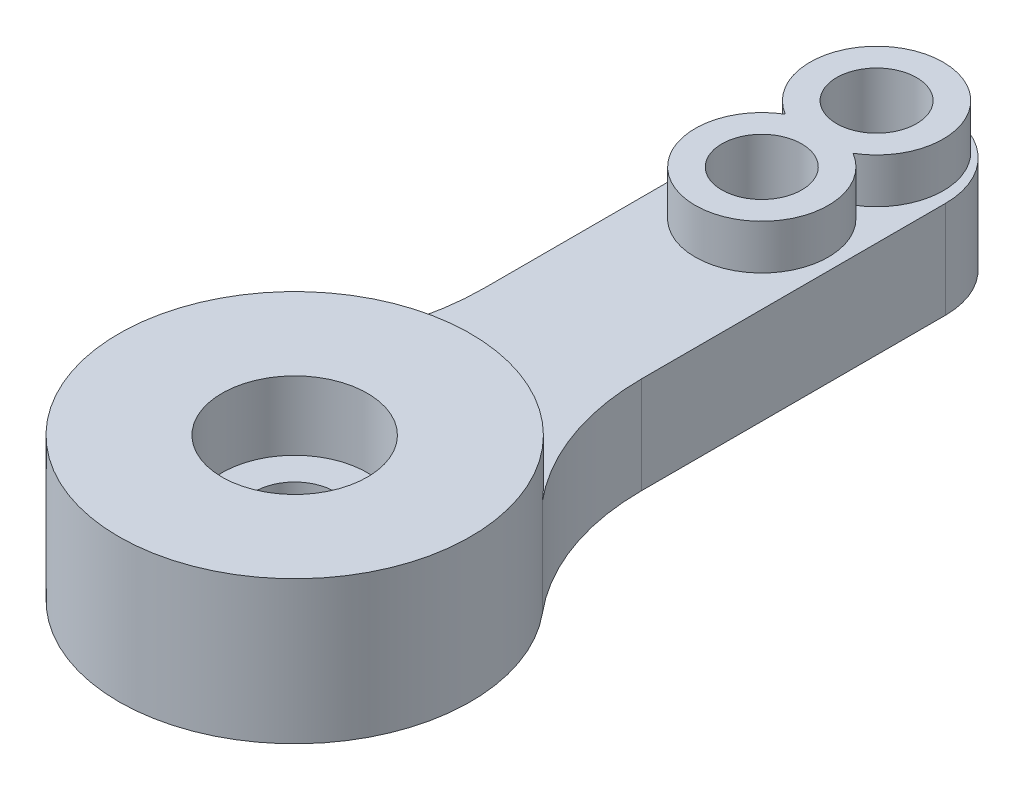
ISO-10303-21;
HEADER;
FILE_DESCRIPTION(('STEP AP214'),'2;1');
FILE_NAME('part.step','',(''),(''),'','','');
FILE_SCHEMA(('AUTOMOTIVE_DESIGN { 1 0 10303 214 1 1 1 1 }'));
ENDSEC;
DATA;
#1=APPLICATION_CONTEXT('core data for automotive mechanical design processes');
#2=APPLICATION_PROTOCOL_DEFINITION('international standard','automotive_design',2000,#1);
#3=PRODUCT_CONTEXT('',#1,'mechanical');
#4=PRODUCT('Part','Part','',(#3));
#5=PRODUCT_RELATED_PRODUCT_CATEGORY('part','',(#4));
#6=PRODUCT_DEFINITION_FORMATION('','',#4);
#7=PRODUCT_DEFINITION_CONTEXT('part definition',#1,'design');
#8=PRODUCT_DEFINITION('design','',#6,#7);
#9=PRODUCT_DEFINITION_SHAPE('','',#8);
#10=(LENGTH_UNIT() NAMED_UNIT(*) SI_UNIT(.MILLI.,.METRE.));
#11=(NAMED_UNIT(*) PLANE_ANGLE_UNIT() SI_UNIT($,.RADIAN.));
#12=(NAMED_UNIT(*) SI_UNIT($,.STERADIAN.) SOLID_ANGLE_UNIT());
#13=UNCERTAINTY_MEASURE_WITH_UNIT(LENGTH_MEASURE(1.E-05),#10,'distance_accuracy_value','');
#14=(GEOMETRIC_REPRESENTATION_CONTEXT(3) GLOBAL_UNCERTAINTY_ASSIGNED_CONTEXT((#13)) GLOBAL_UNIT_ASSIGNED_CONTEXT((#10,
#11,#12)) REPRESENTATION_CONTEXT('',''));
#15=CARTESIAN_POINT('',(0.,0.,0.));
#16=DIRECTION('',(0.,0.,1.));
#17=DIRECTION('',(1.,0.,0.));
#18=AXIS2_PLACEMENT_3D('',#15,#16,#17);
#19=CARTESIAN_POINT('',(0.,0.,0.));
#20=DIRECTION('',(0.,1.,0.));
#21=DIRECTION('',(0.,0.,1.));
#22=AXIS2_PLACEMENT_3D('',#19,#20,#21);
#23=CYLINDRICAL_SURFACE('',#22,1.65);
#24=CARTESIAN_POINT('',(0.,0.,0.));
#25=DIRECTION('',(0.,1.,0.));
#26=DIRECTION('',(0.,0.,1.));
#27=AXIS2_PLACEMENT_3D('',#24,#25,#26);
#28=CIRCLE('',#27,1.65);
#29=CARTESIAN_POINT('',(0.,0.,1.65));
#30=VERTEX_POINT('',#29);
#31=EDGE_CURVE('E125',#30,#30,#28,.T.);
#32=ORIENTED_EDGE('',*,*,#31,.F.);
#33=EDGE_LOOP('',(#32));
#34=FACE_BOUND('',#33,.T.);
#35=CARTESIAN_POINT('',(0.,3.06,0.));
#36=DIRECTION('',(0.,1.,0.));
#37=DIRECTION('',(0.,0.,1.));
#38=AXIS2_PLACEMENT_3D('',#35,#36,#37);
#39=CIRCLE('',#38,1.65);
#40=CARTESIAN_POINT('',(0.,3.06,1.65));
#41=VERTEX_POINT('',#40);
#42=EDGE_CURVE('E36',#41,#41,#39,.F.);
#43=ORIENTED_EDGE('',*,*,#42,.F.);
#44=EDGE_LOOP('',(#43));
#45=FACE_BOUND('',#44,.T.);
#46=ADVANCED_FACE('F32',(#34,#45),#23,.F.);
#47=CARTESIAN_POINT('',(0.,4.,-23.625));
#48=DIRECTION('',(0.,1.,0.));
#49=DIRECTION('',(0.,0.,1.));
#50=AXIS2_PLACEMENT_3D('',#47,#48,#49);
#51=PLANE('',#50);
#52=CARTESIAN_POINT('',(0.,4.,0.));
#53=DIRECTION('',(0.,1.,0.));
#54=DIRECTION('',(0.,0.,1.));
#55=AXIS2_PLACEMENT_3D('',#52,#53,#54);
#56=CIRCLE('',#55,7.26);
#57=CARTESIAN_POINT('',(5.57118771726538,4.,-4.65504752059433));
#58=VERTEX_POINT('',#57);
#59=CARTESIAN_POINT('',(-5.57118771726542,4.,-4.65504752059427));
#60=VERTEX_POINT('',#59);
#61=EDGE_CURVE('E128',#58,#60,#56,.T.);
#62=ORIENTED_EDGE('',*,*,#61,.F.);
#63=CARTESIAN_POINT('',(13.2450000000001,4.,-11.066958705986));
#64=DIRECTION('',(0.,1.,0.));
#65=DIRECTION('',(0.,0.,1.));
#66=AXIS2_PLACEMENT_3D('',#63,#64,#65);
#67=CIRCLE('',#66,10.);
#68=CARTESIAN_POINT('',(3.24500000000006,4.,-11.0669587059861));
#69=VERTEX_POINT('',#68);
#70=EDGE_CURVE('E170',#58,#69,#67,.F.);
#71=ORIENTED_EDGE('',*,*,#70,.T.);
#72=DIRECTION('',(0.,0.,-1.));
#73=VECTOR('',#72,1.);
#74=CARTESIAN_POINT('',(3.24500000000023,4.,-23.625));
#75=LINE('',#74,#73);
#76=CARTESIAN_POINT('',(3.24500000000023,4.,-23.625));
#77=VERTEX_POINT('',#76);
#78=EDGE_CURVE('E142',#69,#77,#75,.T.);
#79=ORIENTED_EDGE('',*,*,#78,.T.);
#80=CARTESIAN_POINT('',(0.,4.,-23.625));
#81=DIRECTION('',(0.,1.,0.));
#82=DIRECTION('',(0.,0.,1.));
#83=AXIS2_PLACEMENT_3D('',#80,#81,#82);
#84=CIRCLE('',#83,3.24500000000011);
#85=CARTESIAN_POINT('',(-3.245,4.,-23.625));
#86=VERTEX_POINT('',#85);
#87=EDGE_CURVE('E136',#77,#86,#84,.T.);
#88=ORIENTED_EDGE('',*,*,#87,.T.);
#89=DIRECTION('',(0.,0.,1.));
#90=VECTOR('',#89,1.);
#91=CARTESIAN_POINT('',(-3.24500000000022,4.,-6.49442645658557));
#92=LINE('',#91,#90);
#93=CARTESIAN_POINT('',(-3.24500000000016,4.,-11.0669587059857));
#94=VERTEX_POINT('',#93);
#95=EDGE_CURVE('E139',#86,#94,#92,.T.);
#96=ORIENTED_EDGE('',*,*,#95,.T.);
#97=CARTESIAN_POINT('',(-13.2450000000002,4.,-11.0669587059858));
#98=DIRECTION('',(0.,1.,0.));
#99=DIRECTION('',(0.,0.,1.));
#100=AXIS2_PLACEMENT_3D('',#97,#98,#99);
#101=CIRCLE('',#100,10.);
#102=EDGE_CURVE('E11',#94,#60,#101,.F.);
#103=ORIENTED_EDGE('',*,*,#102,.T.);
#104=EDGE_LOOP('',(#62,#71,#79,#88,#96,#103));
#105=FACE_BOUND('',#104,.T.);
#106=CARTESIAN_POINT('',(0.,4.,-24.02));
#107=DIRECTION('',(0.,1.,0.));
#108=DIRECTION('',(0.,0.,1.));
#109=AXIS2_PLACEMENT_3D('',#106,#107,#108);
#110=CIRCLE('',#109,2.75);
#111=CARTESIAN_POINT('',(1.39484766193302,4.,-21.65));
#112=VERTEX_POINT('',#111);
#113=CARTESIAN_POINT('',(-1.39484766193302,4.,-21.65));
#114=VERTEX_POINT('',#113);
#115=EDGE_CURVE('E112',#112,#114,#110,.T.);
#116=ORIENTED_EDGE('',*,*,#115,.F.);
#117=CARTESIAN_POINT('',(0.,4.,-19.28));
#118=DIRECTION('',(0.,1.,0.));
#119=DIRECTION('',(0.,0.,1.));
#120=AXIS2_PLACEMENT_3D('',#117,#118,#119);
#121=CIRCLE('',#120,2.75);
#122=EDGE_CURVE('E116',#114,#112,#121,.T.);
#123=ORIENTED_EDGE('',*,*,#122,.F.);
#124=EDGE_LOOP('',(#116,#123));
#125=FACE_BOUND('',#124,.T.);
#126=ADVANCED_FACE('F175',(#105,#125),#51,.T.);
#127=CARTESIAN_POINT('',(0.,4.,-23.625));
#128=DIRECTION('',(0.,-1.,0.));
#129=DIRECTION('',(0.,0.,-1.));
#130=AXIS2_PLACEMENT_3D('',#127,#128,#129);
#131=CYLINDRICAL_SURFACE('',#130,3.24500000000011);
#132=CARTESIAN_POINT('',(0.,0.,-23.625));
#133=DIRECTION('',(0.,1.,0.));
#134=DIRECTION('',(0.,0.,1.));
#135=AXIS2_PLACEMENT_3D('',#132,#133,#134);
#136=CIRCLE('',#135,3.24500000000011);
#137=CARTESIAN_POINT('',(3.24500000000023,0.,-23.625));
#138=VERTEX_POINT('',#137);
#139=CARTESIAN_POINT('',(-3.245,0.,-23.625));
#140=VERTEX_POINT('',#139);
#141=EDGE_CURVE('E134',#138,#140,#136,.T.);
#142=ORIENTED_EDGE('',*,*,#141,.T.);
#143=DIRECTION('',(0.,-1.,0.));
#144=VECTOR('',#143,1.);
#145=CARTESIAN_POINT('',(-3.245,4.,-23.625));
#146=LINE('',#145,#144);
#147=EDGE_CURVE('E155',#86,#140,#146,.T.);
#148=ORIENTED_EDGE('',*,*,#147,.F.);
#149=ORIENTED_EDGE('',*,*,#87,.F.);
#150=DIRECTION('',(0.,-1.,0.));
#151=VECTOR('',#150,1.);
#152=CARTESIAN_POINT('',(3.24500000000023,4.,-23.625));
#153=LINE('',#152,#151);
#154=EDGE_CURVE('E144',#77,#138,#153,.T.);
#155=ORIENTED_EDGE('',*,*,#154,.T.);
#156=EDGE_LOOP('',(#142,#148,#149,#155));
#157=FACE_BOUND('',#156,.T.);
#158=ADVANCED_FACE('F197',(#157),#131,.T.);
#159=CARTESIAN_POINT('',(-3.24500000000022,4.,-6.49442645658557));
#160=DIRECTION('',(1.,0.,0.));
#161=DIRECTION('',(0.,0.,-1.));
#162=AXIS2_PLACEMENT_3D('',#159,#160,#161);
#163=PLANE('',#162);
#164=DIRECTION('',(0.,0.,1.));
#165=VECTOR('',#164,1.);
#166=CARTESIAN_POINT('',(-3.24500000000022,0.,-6.49442645658557));
#167=LINE('',#166,#165);
#168=CARTESIAN_POINT('',(-3.24500000000016,0.,-11.0669587059857));
#169=VERTEX_POINT('',#168);
#170=EDGE_CURVE('E147',#140,#169,#167,.T.);
#171=ORIENTED_EDGE('',*,*,#170,.T.);
#172=DIRECTION('',(0.,1.,0.));
#173=VECTOR('',#172,1.);
#174=CARTESIAN_POINT('',(-3.24500000000016,4.,-11.0669587059857));
#175=LINE('',#174,#173);
#176=EDGE_CURVE('E48',#169,#94,#175,.T.);
#177=ORIENTED_EDGE('',*,*,#176,.T.);
#178=ORIENTED_EDGE('',*,*,#95,.F.);
#179=ORIENTED_EDGE('',*,*,#147,.T.);
#180=EDGE_LOOP('',(#171,#177,#178,#179));
#181=FACE_BOUND('',#180,.T.);
#182=ADVANCED_FACE('F195',(#181),#163,.F.);
#183=CARTESIAN_POINT('',(0.,4.,0.));
#184=DIRECTION('',(0.,-1.,0.));
#185=DIRECTION('',(0.,0.,-1.));
#186=AXIS2_PLACEMENT_3D('',#183,#184,#185);
#187=CYLINDRICAL_SURFACE('',#186,7.26);
#188=CARTESIAN_POINT('',(0.,0.,0.));
#189=DIRECTION('',(0.,1.,0.));
#190=DIRECTION('',(0.,0.,1.));
#191=AXIS2_PLACEMENT_3D('',#188,#189,#190);
#192=CIRCLE('',#191,7.26);
#193=CARTESIAN_POINT('',(-5.57118771726542,0.,-4.65504752059427));
#194=VERTEX_POINT('',#193);
#195=CARTESIAN_POINT('',(5.57118771726538,0.,-4.65504752059433));
#196=VERTEX_POINT('',#195);
#197=EDGE_CURVE('E149',#194,#196,#192,.T.);
#198=ORIENTED_EDGE('',*,*,#197,.T.);
#199=DIRECTION('',(0.,-1.,0.));
#200=VECTOR('',#199,1.);
#201=CARTESIAN_POINT('',(5.57118771726538,4.,-4.65504752059433));
#202=LINE('',#201,#200);
#203=EDGE_CURVE('E164',#196,#58,#202,.F.);
#204=ORIENTED_EDGE('',*,*,#203,.T.);
#205=ORIENTED_EDGE('',*,*,#61,.T.);
#206=DIRECTION('',(0.,-1.,0.));
#207=VECTOR('',#206,1.);
#208=CARTESIAN_POINT('',(-5.57118771726542,4.,-4.65504752059427));
#209=LINE('',#208,#207);
#210=EDGE_CURVE('E161',#60,#194,#209,.T.);
#211=ORIENTED_EDGE('',*,*,#210,.T.);
#212=EDGE_LOOP('',(#198,#204,#205,#211));
#213=FACE_BOUND('',#212,.T.);
#214=CARTESIAN_POINT('',(0.,5.9,0.));
#215=DIRECTION('',(0.,1.,0.));
#216=DIRECTION('',(0.,0.,1.));
#217=AXIS2_PLACEMENT_3D('',#214,#215,#216);
#218=CIRCLE('',#217,7.26);
#219=CARTESIAN_POINT('',(0.,5.9,7.26));
#220=VERTEX_POINT('',#219);
#221=EDGE_CURVE('E131',#220,#220,#218,.T.);
#222=ORIENTED_EDGE('',*,*,#221,.F.);
#223=EDGE_LOOP('',(#222));
#224=FACE_BOUND('',#223,.T.);
#225=ADVANCED_FACE('F189',(#213,#224),#187,.T.);
#226=CARTESIAN_POINT('',(3.24500000000023,4.,-23.625));
#227=DIRECTION('',(-1.,0.,0.));
#228=DIRECTION('',(0.,0.,1.));
#229=AXIS2_PLACEMENT_3D('',#226,#227,#228);
#230=PLANE('',#229);
#231=ORIENTED_EDGE('',*,*,#78,.F.);
#232=DIRECTION('',(0.,1.,0.));
#233=VECTOR('',#232,1.);
#234=CARTESIAN_POINT('',(3.24500000000006,0.,-11.0669587059861));
#235=LINE('',#234,#233);
#236=CARTESIAN_POINT('',(3.24500000000006,0.,-11.0669587059861));
#237=VERTEX_POINT('',#236);
#238=EDGE_CURVE('E158',#69,#237,#235,.F.);
#239=ORIENTED_EDGE('',*,*,#238,.T.);
#240=DIRECTION('',(0.,0.,-1.));
#241=VECTOR('',#240,1.);
#242=CARTESIAN_POINT('',(3.24500000000023,0.,-23.625));
#243=LINE('',#242,#241);
#244=EDGE_CURVE('E140',#237,#138,#243,.T.);
#245=ORIENTED_EDGE('',*,*,#244,.T.);
#246=ORIENTED_EDGE('',*,*,#154,.F.);
#247=EDGE_LOOP('',(#231,#239,#245,#246));
#248=FACE_BOUND('',#247,.T.);
#249=ADVANCED_FACE('F182',(#248),#230,.F.);
#250=CARTESIAN_POINT('',(0.,0.,-23.625));
#251=DIRECTION('',(0.,1.,0.));
#252=DIRECTION('',(0.,0.,1.));
#253=AXIS2_PLACEMENT_3D('',#250,#251,#252);
#254=PLANE('',#253);
#255=ORIENTED_EDGE('',*,*,#31,.T.);
#256=EDGE_LOOP('',(#255));
#257=FACE_BOUND('',#256,.T.);
#258=CARTESIAN_POINT('',(0.,0.,-19.28));
#259=DIRECTION('',(0.,1.,0.));
#260=DIRECTION('',(0.,0.,1.));
#261=AXIS2_PLACEMENT_3D('',#258,#259,#260);
#262=CIRCLE('',#261,1.65);
#263=CARTESIAN_POINT('',(0.,0.,-17.63));
#264=VERTEX_POINT('',#263);
#265=EDGE_CURVE('E120',#264,#264,#262,.T.);
#266=ORIENTED_EDGE('',*,*,#265,.T.);
#267=EDGE_LOOP('',(#266));
#268=FACE_BOUND('',#267,.T.);
#269=CARTESIAN_POINT('',(0.,0.,-24.02));
#270=DIRECTION('',(0.,1.,0.));
#271=DIRECTION('',(0.,0.,1.));
#272=AXIS2_PLACEMENT_3D('',#269,#270,#271);
#273=CIRCLE('',#272,1.65);
#274=CARTESIAN_POINT('',(0.,0.,-22.37));
#275=VERTEX_POINT('',#274);
#276=EDGE_CURVE('E117',#275,#275,#273,.T.);
#277=ORIENTED_EDGE('',*,*,#276,.T.);
#278=EDGE_LOOP('',(#277));
#279=FACE_BOUND('',#278,.T.);
#280=ORIENTED_EDGE('',*,*,#141,.F.);
#281=ORIENTED_EDGE('',*,*,#244,.F.);
#282=CARTESIAN_POINT('',(13.2450000000001,0.,-11.066958705986));
#283=DIRECTION('',(0.,1.,0.));
#284=DIRECTION('',(0.,0.,1.));
#285=AXIS2_PLACEMENT_3D('',#282,#283,#284);
#286=CIRCLE('',#285,10.);
#287=EDGE_CURVE('E168',#237,#196,#286,.T.);
#288=ORIENTED_EDGE('',*,*,#287,.T.);
#289=ORIENTED_EDGE('',*,*,#197,.F.);
#290=CARTESIAN_POINT('',(-13.2450000000002,0.,-11.0669587059858));
#291=DIRECTION('',(0.,1.,0.));
#292=DIRECTION('',(0.,0.,1.));
#293=AXIS2_PLACEMENT_3D('',#290,#291,#292);
#294=CIRCLE('',#293,10.);
#295=EDGE_CURVE('E41',#194,#169,#294,.T.);
#296=ORIENTED_EDGE('',*,*,#295,.T.);
#297=ORIENTED_EDGE('',*,*,#170,.F.);
#298=EDGE_LOOP('',(#280,#281,#288,#289,#296,#297));
#299=FACE_BOUND('',#298,.T.);
#300=ADVANCED_FACE('F187',(#257,#268,#279,#299),#254,.F.);
#301=CARTESIAN_POINT('',(0.,5.9,0.));
#302=DIRECTION('',(0.,1.,0.));
#303=DIRECTION('',(0.,0.,1.));
#304=AXIS2_PLACEMENT_3D('',#301,#302,#303);
#305=PLANE('',#304);
#306=CARTESIAN_POINT('',(0.,5.9,0.));
#307=DIRECTION('',(0.,1.,0.));
#308=DIRECTION('',(0.,0.,1.));
#309=AXIS2_PLACEMENT_3D('',#306,#307,#308);
#310=CIRCLE('',#309,3.);
#311=CARTESIAN_POINT('',(0.,5.9,3.));
#312=VERTEX_POINT('',#311);
#313=EDGE_CURVE('E362',#312,#312,#310,.T.);
#314=ORIENTED_EDGE('',*,*,#313,.F.);
#315=EDGE_LOOP('',(#314));
#316=FACE_BOUND('',#315,.T.);
#317=ORIENTED_EDGE('',*,*,#221,.T.);
#318=EDGE_LOOP('',(#317));
#319=FACE_BOUND('',#318,.T.);
#320=ADVANCED_FACE('F223',(#316,#319),#305,.T.);
#321=CARTESIAN_POINT('',(0.,0.,-24.02));
#322=DIRECTION('',(0.,1.,0.));
#323=DIRECTION('',(0.,0.,1.));
#324=AXIS2_PLACEMENT_3D('',#321,#322,#323);
#325=CYLINDRICAL_SURFACE('',#324,1.65);
#326=ORIENTED_EDGE('',*,*,#276,.F.);
#327=EDGE_LOOP('',(#326));
#328=FACE_BOUND('',#327,.T.);
#329=CARTESIAN_POINT('',(0.,5.85,-24.02));
#330=DIRECTION('',(0.,1.,0.));
#331=DIRECTION('',(0.,0.,1.));
#332=AXIS2_PLACEMENT_3D('',#329,#330,#331);
#333=CIRCLE('',#332,1.65);
#334=CARTESIAN_POINT('',(0.,5.85,-22.37));
#335=VERTEX_POINT('',#334);
#336=EDGE_CURVE('E369',#335,#335,#333,.T.);
#337=ORIENTED_EDGE('',*,*,#336,.T.);
#338=EDGE_LOOP('',(#337));
#339=FACE_BOUND('',#338,.T.);
#340=ADVANCED_FACE('F219',(#328,#339),#325,.F.);
#341=CARTESIAN_POINT('',(0.,0.,-19.28));
#342=DIRECTION('',(0.,1.,0.));
#343=DIRECTION('',(0.,0.,1.));
#344=AXIS2_PLACEMENT_3D('',#341,#342,#343);
#345=CYLINDRICAL_SURFACE('',#344,1.65);
#346=ORIENTED_EDGE('',*,*,#265,.F.);
#347=EDGE_LOOP('',(#346));
#348=FACE_BOUND('',#347,.T.);
#349=CARTESIAN_POINT('',(0.,5.85,-19.28));
#350=DIRECTION('',(0.,1.,0.));
#351=DIRECTION('',(0.,0.,1.));
#352=AXIS2_PLACEMENT_3D('',#349,#350,#351);
#353=CIRCLE('',#352,1.65);
#354=CARTESIAN_POINT('',(0.,5.85,-17.63));
#355=VERTEX_POINT('',#354);
#356=EDGE_CURVE('E366',#355,#355,#353,.T.);
#357=ORIENTED_EDGE('',*,*,#356,.T.);
#358=EDGE_LOOP('',(#357));
#359=FACE_BOUND('',#358,.T.);
#360=ADVANCED_FACE('F216',(#348,#359),#345,.F.);
#361=CARTESIAN_POINT('',(0.,5.85,-21.65));
#362=DIRECTION('',(0.,1.,0.));
#363=DIRECTION('',(0.,0.,1.));
#364=AXIS2_PLACEMENT_3D('',#361,#362,#363);
#365=PLANE('',#364);
#366=ORIENTED_EDGE('',*,*,#336,.F.);
#367=EDGE_LOOP('',(#366));
#368=FACE_BOUND('',#367,.T.);
#369=CARTESIAN_POINT('',(0.,5.85,-19.28));
#370=DIRECTION('',(0.,1.,0.));
#371=DIRECTION('',(0.,0.,1.));
#372=AXIS2_PLACEMENT_3D('',#369,#370,#371);
#373=CIRCLE('',#372,2.75);
#374=CARTESIAN_POINT('',(-1.39484766193302,5.85,-21.65));
#375=VERTEX_POINT('',#374);
#376=CARTESIAN_POINT('',(1.39484766193302,5.85,-21.65));
#377=VERTEX_POINT('',#376);
#378=EDGE_CURVE('E107',#375,#377,#373,.T.);
#379=ORIENTED_EDGE('',*,*,#378,.T.);
#380=CARTESIAN_POINT('',(0.,5.85,-24.02));
#381=DIRECTION('',(0.,1.,0.));
#382=DIRECTION('',(0.,0.,1.));
#383=AXIS2_PLACEMENT_3D('',#380,#381,#382);
#384=CIRCLE('',#383,2.75);
#385=EDGE_CURVE('E97',#377,#375,#384,.T.);
#386=ORIENTED_EDGE('',*,*,#385,.T.);
#387=EDGE_LOOP('',(#379,#386));
#388=FACE_BOUND('',#387,.T.);
#389=ORIENTED_EDGE('',*,*,#356,.F.);
#390=EDGE_LOOP('',(#389));
#391=FACE_BOUND('',#390,.T.);
#392=ADVANCED_FACE('F109',(#368,#388,#391),#365,.T.);
#393=CARTESIAN_POINT('',(0.,5.85,-19.28));
#394=DIRECTION('',(0.,-1.,0.));
#395=DIRECTION('',(0.,0.,-1.));
#396=AXIS2_PLACEMENT_3D('',#393,#394,#395);
#397=CYLINDRICAL_SURFACE('',#396,2.75);
#398=ORIENTED_EDGE('',*,*,#122,.T.);
#399=DIRECTION('',(0.,-1.,0.));
#400=VECTOR('',#399,1.);
#401=CARTESIAN_POINT('',(1.39484766193302,5.85,-21.65));
#402=LINE('',#401,#400);
#403=EDGE_CURVE('E101',#377,#112,#402,.T.);
#404=ORIENTED_EDGE('',*,*,#403,.F.);
#405=ORIENTED_EDGE('',*,*,#378,.F.);
#406=DIRECTION('',(0.,-1.,0.));
#407=VECTOR('',#406,1.);
#408=CARTESIAN_POINT('',(-1.39484766193302,5.85,-21.65));
#409=LINE('',#408,#407);
#410=EDGE_CURVE('E104',#375,#114,#409,.T.);
#411=ORIENTED_EDGE('',*,*,#410,.T.);
#412=EDGE_LOOP('',(#398,#404,#405,#411));
#413=FACE_BOUND('',#412,.T.);
#414=ADVANCED_FACE('F114',(#413),#397,.T.);
#415=CARTESIAN_POINT('',(0.,5.85,-24.02));
#416=DIRECTION('',(0.,-1.,0.));
#417=DIRECTION('',(0.,0.,-1.));
#418=AXIS2_PLACEMENT_3D('',#415,#416,#417);
#419=CYLINDRICAL_SURFACE('',#418,2.75);
#420=ORIENTED_EDGE('',*,*,#115,.T.);
#421=ORIENTED_EDGE('',*,*,#410,.F.);
#422=ORIENTED_EDGE('',*,*,#385,.F.);
#423=ORIENTED_EDGE('',*,*,#403,.T.);
#424=EDGE_LOOP('',(#420,#421,#422,#423));
#425=FACE_BOUND('',#424,.T.);
#426=ADVANCED_FACE('F99',(#425),#419,.T.);
#427=CARTESIAN_POINT('',(13.2450000000001,4.,-11.066958705986));
#428=DIRECTION('',(0.,-1.,0.));
#429=DIRECTION('',(0.,0.,-1.));
#430=AXIS2_PLACEMENT_3D('',#427,#428,#429);
#431=CYLINDRICAL_SURFACE('',#430,10.);
#432=ORIENTED_EDGE('',*,*,#70,.F.);
#433=ORIENTED_EDGE('',*,*,#203,.F.);
#434=ORIENTED_EDGE('',*,*,#287,.F.);
#435=ORIENTED_EDGE('',*,*,#238,.F.);
#436=EDGE_LOOP('',(#432,#433,#434,#435));
#437=FACE_BOUND('',#436,.T.);
#438=ADVANCED_FACE('F185',(#437),#431,.F.);
#439=CARTESIAN_POINT('',(-13.2450000000002,4.,-11.0669587059858));
#440=DIRECTION('',(0.,-1.,0.));
#441=DIRECTION('',(0.,0.,-1.));
#442=AXIS2_PLACEMENT_3D('',#439,#440,#441);
#443=CYLINDRICAL_SURFACE('',#442,10.);
#444=ORIENTED_EDGE('',*,*,#102,.F.);
#445=ORIENTED_EDGE('',*,*,#176,.F.);
#446=ORIENTED_EDGE('',*,*,#295,.F.);
#447=ORIENTED_EDGE('',*,*,#210,.F.);
#448=EDGE_LOOP('',(#444,#445,#446,#447));
#449=FACE_BOUND('',#448,.T.);
#450=ADVANCED_FACE('F34',(#449),#443,.F.);
#451=CARTESIAN_POINT('',(0.,3.06,0.));
#452=DIRECTION('',(0.,1.,0.));
#453=DIRECTION('',(0.,0.,1.));
#454=AXIS2_PLACEMENT_3D('',#451,#452,#453);
#455=PLANE('',#454);
#456=CARTESIAN_POINT('',(0.,3.06,0.));
#457=DIRECTION('',(0.,1.,0.));
#458=DIRECTION('',(0.,0.,1.));
#459=AXIS2_PLACEMENT_3D('',#456,#457,#458);
#460=CIRCLE('',#459,3.);
#461=CARTESIAN_POINT('',(0.,3.06,3.));
#462=VERTEX_POINT('',#461);
#463=EDGE_CURVE('E359',#462,#462,#460,.T.);
#464=ORIENTED_EDGE('',*,*,#463,.T.);
#465=EDGE_LOOP('',(#464));
#466=FACE_BOUND('',#465,.T.);
#467=ORIENTED_EDGE('',*,*,#42,.T.);
#468=EDGE_LOOP('',(#467));
#469=FACE_BOUND('',#468,.T.);
#470=ADVANCED_FACE('F288',(#466,#469),#455,.T.);
#471=CARTESIAN_POINT('',(0.,3.06,0.));
#472=DIRECTION('',(0.,1.,0.));
#473=DIRECTION('',(0.,0.,1.));
#474=AXIS2_PLACEMENT_3D('',#471,#472,#473);
#475=CYLINDRICAL_SURFACE('',#474,3.);
#476=ORIENTED_EDGE('',*,*,#463,.F.);
#477=EDGE_LOOP('',(#476));
#478=FACE_BOUND('',#477,.T.);
#479=ORIENTED_EDGE('',*,*,#313,.T.);
#480=EDGE_LOOP('',(#479));
#481=FACE_BOUND('',#480,.T.);
#482=ADVANCED_FACE('F293',(#478,#481),#475,.F.);
#483=CLOSED_SHELL('',(#46,#126,#158,#182,#225,#249,#300,#320,#340,#360,#392,#414,#426,#438,#450,
#470,#482));
#484=MANIFOLD_SOLID_BREP('B2',#483);
#485=ADVANCED_BREP_SHAPE_REPRESENTATION('',(#18,#484),#14);
#486=SHAPE_DEFINITION_REPRESENTATION(#9,#485);
ENDSEC;
END-ISO-10303-21;
